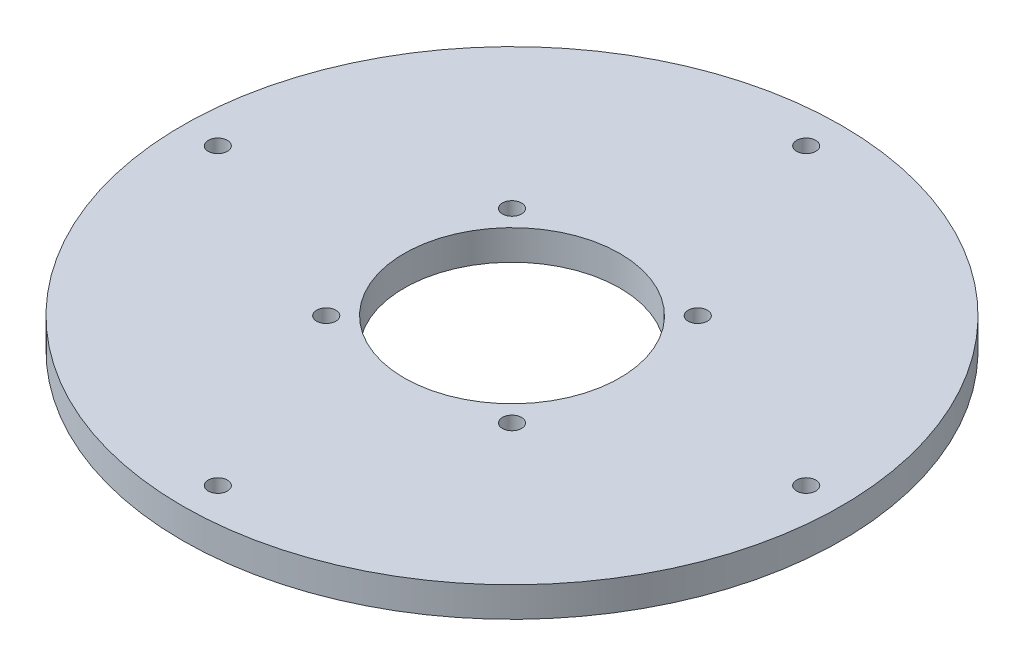
ISO-10303-21;
HEADER;
FILE_DESCRIPTION(('STEP AP214'),'2;1');
FILE_NAME('part.step','',(''),(''),'','','');
FILE_SCHEMA(('AUTOMOTIVE_DESIGN { 1 0 10303 214 1 1 1 1 }'));
ENDSEC;
DATA;
#1=APPLICATION_CONTEXT('core data for automotive mechanical design processes');
#2=APPLICATION_PROTOCOL_DEFINITION('international standard','automotive_design',2000,#1);
#3=PRODUCT_CONTEXT('',#1,'mechanical');
#4=PRODUCT('Part','Part','',(#3));
#5=PRODUCT_RELATED_PRODUCT_CATEGORY('part','',(#4));
#6=PRODUCT_DEFINITION_FORMATION('','',#4);
#7=PRODUCT_DEFINITION_CONTEXT('part definition',#1,'design');
#8=PRODUCT_DEFINITION('design','',#6,#7);
#9=PRODUCT_DEFINITION_SHAPE('','',#8);
#10=(LENGTH_UNIT() NAMED_UNIT(*) SI_UNIT(.MILLI.,.METRE.));
#11=(NAMED_UNIT(*) PLANE_ANGLE_UNIT() SI_UNIT($,.RADIAN.));
#12=(NAMED_UNIT(*) SI_UNIT($,.STERADIAN.) SOLID_ANGLE_UNIT());
#13=UNCERTAINTY_MEASURE_WITH_UNIT(LENGTH_MEASURE(1.E-05),#10,'distance_accuracy_value','');
#14=(GEOMETRIC_REPRESENTATION_CONTEXT(3) GLOBAL_UNCERTAINTY_ASSIGNED_CONTEXT((#13)) GLOBAL_UNIT_ASSIGNED_CONTEXT((#10,
#11,#12)) REPRESENTATION_CONTEXT('',''));
#15=CARTESIAN_POINT('',(0.,0.,0.));
#16=DIRECTION('',(0.,0.,1.));
#17=DIRECTION('',(1.,0.,0.));
#18=AXIS2_PLACEMENT_3D('',#15,#16,#17);
#19=CARTESIAN_POINT('',(0.,5.,0.));
#20=DIRECTION('',(0.,-1.,0.));
#21=DIRECTION('',(0.,0.,-1.));
#22=AXIS2_PLACEMENT_3D('',#19,#20,#21);
#23=PLANE('',#22);
#24=CARTESIAN_POINT('',(15.5,5.,15.5));
#25=DIRECTION('',(0.,1.,0.));
#26=DIRECTION('',(0.,0.,1.));
#27=AXIS2_PLACEMENT_3D('',#24,#25,#26);
#28=CIRCLE('',#27,1.6);
#29=CARTESIAN_POINT('',(15.5,5.,17.1));
#30=VERTEX_POINT('',#29);
#31=EDGE_CURVE('E66',#30,#30,#28,.T.);
#32=ORIENTED_EDGE('',*,*,#31,.F.);
#33=EDGE_LOOP('',(#32));
#34=FACE_BOUND('',#33,.T.);
#35=CARTESIAN_POINT('',(15.5,5.,-15.5));
#36=DIRECTION('',(0.,1.,0.));
#37=DIRECTION('',(0.,0.,1.));
#38=AXIS2_PLACEMENT_3D('',#35,#36,#37);
#39=CIRCLE('',#38,1.6);
#40=CARTESIAN_POINT('',(15.5,5.,-13.9));
#41=VERTEX_POINT('',#40);
#42=EDGE_CURVE('E73',#41,#41,#39,.T.);
#43=ORIENTED_EDGE('',*,*,#42,.F.);
#44=EDGE_LOOP('',(#43));
#45=FACE_BOUND('',#44,.T.);
#46=CARTESIAN_POINT('',(-15.5,5.,-15.5));
#47=DIRECTION('',(0.,1.,0.));
#48=DIRECTION('',(0.,0.,1.));
#49=AXIS2_PLACEMENT_3D('',#46,#47,#48);
#50=CIRCLE('',#49,1.6);
#51=CARTESIAN_POINT('',(-15.5,5.,-13.9));
#52=VERTEX_POINT('',#51);
#53=EDGE_CURVE('E60',#52,#52,#50,.T.);
#54=ORIENTED_EDGE('',*,*,#53,.F.);
#55=EDGE_LOOP('',(#54));
#56=FACE_BOUND('',#55,.T.);
#57=CARTESIAN_POINT('',(-15.5,5.,15.5));
#58=DIRECTION('',(0.,1.,0.));
#59=DIRECTION('',(0.,0.,1.));
#60=AXIS2_PLACEMENT_3D('',#57,#58,#59);
#61=CIRCLE('',#60,1.6);
#62=CARTESIAN_POINT('',(-15.5,5.,17.1));
#63=VERTEX_POINT('',#62);
#64=EDGE_CURVE('E57',#63,#63,#61,.T.);
#65=ORIENTED_EDGE('',*,*,#64,.F.);
#66=EDGE_LOOP('',(#65));
#67=FACE_BOUND('',#66,.T.);
#68=CARTESIAN_POINT('',(0.,5.,0.));
#69=DIRECTION('',(0.,1.,0.));
#70=DIRECTION('',(0.,0.,1.));
#71=AXIS2_PLACEMENT_3D('',#68,#69,#70);
#72=CIRCLE('',#71,18.);
#73=CARTESIAN_POINT('',(0.,5.,18.));
#74=VERTEX_POINT('',#73);
#75=EDGE_CURVE('E10',#74,#74,#72,.T.);
#76=ORIENTED_EDGE('',*,*,#75,.F.);
#77=EDGE_LOOP('',(#76));
#78=FACE_BOUND('',#77,.T.);
#79=CARTESIAN_POINT('',(-49.1,5.,0.));
#80=DIRECTION('',(0.,1.,0.));
#81=DIRECTION('',(0.,0.,1.));
#82=AXIS2_PLACEMENT_3D('',#79,#80,#81);
#83=CIRCLE('',#82,1.6);
#84=CARTESIAN_POINT('',(-49.1,5.,1.6));
#85=VERTEX_POINT('',#84);
#86=EDGE_CURVE('E94',#85,#85,#83,.T.);
#87=ORIENTED_EDGE('',*,*,#86,.F.);
#88=EDGE_LOOP('',(#87));
#89=FACE_BOUND('',#88,.T.);
#90=CARTESIAN_POINT('',(0.,5.,49.1));
#91=DIRECTION('',(0.,1.,0.));
#92=DIRECTION('',(0.,0.,1.));
#93=AXIS2_PLACEMENT_3D('',#90,#91,#92);
#94=CIRCLE('',#93,1.6);
#95=CARTESIAN_POINT('',(0.,5.,50.7));
#96=VERTEX_POINT('',#95);
#97=EDGE_CURVE('E91',#96,#96,#94,.T.);
#98=ORIENTED_EDGE('',*,*,#97,.F.);
#99=EDGE_LOOP('',(#98));
#100=FACE_BOUND('',#99,.T.);
#101=CARTESIAN_POINT('',(49.1,5.,0.));
#102=DIRECTION('',(0.,1.,0.));
#103=DIRECTION('',(0.,0.,1.));
#104=AXIS2_PLACEMENT_3D('',#101,#102,#103);
#105=CIRCLE('',#104,1.6);
#106=CARTESIAN_POINT('',(49.1,5.,1.6));
#107=VERTEX_POINT('',#106);
#108=EDGE_CURVE('E88',#107,#107,#105,.T.);
#109=ORIENTED_EDGE('',*,*,#108,.F.);
#110=EDGE_LOOP('',(#109));
#111=FACE_BOUND('',#110,.T.);
#112=CARTESIAN_POINT('',(0.,5.,-49.1));
#113=DIRECTION('',(0.,1.,0.));
#114=DIRECTION('',(0.,0.,1.));
#115=AXIS2_PLACEMENT_3D('',#112,#113,#114);
#116=CIRCLE('',#115,1.6);
#117=CARTESIAN_POINT('',(0.,5.,-47.5));
#118=VERTEX_POINT('',#117);
#119=EDGE_CURVE('E85',#118,#118,#116,.T.);
#120=ORIENTED_EDGE('',*,*,#119,.F.);
#121=EDGE_LOOP('',(#120));
#122=FACE_BOUND('',#121,.T.);
#123=CARTESIAN_POINT('',(0.,5.,0.));
#124=DIRECTION('',(0.,1.,0.));
#125=DIRECTION('',(0.,0.,1.));
#126=AXIS2_PLACEMENT_3D('',#123,#124,#125);
#127=CIRCLE('',#126,55.);
#128=CARTESIAN_POINT('',(0.,5.,55.));
#129=VERTEX_POINT('',#128);
#130=EDGE_CURVE('E81',#129,#129,#127,.T.);
#131=ORIENTED_EDGE('',*,*,#130,.T.);
#132=EDGE_LOOP('',(#131));
#133=FACE_BOUND('',#132,.T.);
#134=ADVANCED_FACE('F44',(#34,#45,#56,#67,#78,#89,#100,#111,#122,#133),#23,.F.);
#135=CARTESIAN_POINT('',(0.,0.,0.));
#136=DIRECTION('',(0.,-1.,0.));
#137=DIRECTION('',(0.,0.,-1.));
#138=AXIS2_PLACEMENT_3D('',#135,#136,#137);
#139=PLANE('',#138);
#140=CARTESIAN_POINT('',(15.5,0.,15.5));
#141=DIRECTION('',(0.,1.,0.));
#142=DIRECTION('',(0.,0.,1.));
#143=AXIS2_PLACEMENT_3D('',#140,#141,#142);
#144=CIRCLE('',#143,1.6);
#145=CARTESIAN_POINT('',(15.5,0.,17.1));
#146=VERTEX_POINT('',#145);
#147=EDGE_CURVE('E63',#146,#146,#144,.T.);
#148=ORIENTED_EDGE('',*,*,#147,.T.);
#149=EDGE_LOOP('',(#148));
#150=FACE_BOUND('',#149,.T.);
#151=CARTESIAN_POINT('',(15.5,0.,-15.5));
#152=DIRECTION('',(0.,1.,0.));
#153=DIRECTION('',(0.,0.,1.));
#154=AXIS2_PLACEMENT_3D('',#151,#152,#153);
#155=CIRCLE('',#154,1.6);
#156=CARTESIAN_POINT('',(15.5,0.,-13.9));
#157=VERTEX_POINT('',#156);
#158=EDGE_CURVE('E70',#157,#157,#155,.T.);
#159=ORIENTED_EDGE('',*,*,#158,.T.);
#160=EDGE_LOOP('',(#159));
#161=FACE_BOUND('',#160,.T.);
#162=CARTESIAN_POINT('',(-15.5,0.,-15.5));
#163=DIRECTION('',(0.,1.,0.));
#164=DIRECTION('',(0.,0.,1.));
#165=AXIS2_PLACEMENT_3D('',#162,#163,#164);
#166=CIRCLE('',#165,1.6);
#167=CARTESIAN_POINT('',(-15.5,0.,-13.9));
#168=VERTEX_POINT('',#167);
#169=EDGE_CURVE('E76',#168,#168,#166,.T.);
#170=ORIENTED_EDGE('',*,*,#169,.T.);
#171=EDGE_LOOP('',(#170));
#172=FACE_BOUND('',#171,.T.);
#173=CARTESIAN_POINT('',(-15.5,0.,15.5));
#174=DIRECTION('',(0.,1.,0.));
#175=DIRECTION('',(0.,0.,1.));
#176=AXIS2_PLACEMENT_3D('',#173,#174,#175);
#177=CIRCLE('',#176,1.6);
#178=CARTESIAN_POINT('',(-15.5,0.,17.1));
#179=VERTEX_POINT('',#178);
#180=EDGE_CURVE('E55',#179,#179,#177,.T.);
#181=ORIENTED_EDGE('',*,*,#180,.T.);
#182=EDGE_LOOP('',(#181));
#183=FACE_BOUND('',#182,.T.);
#184=CARTESIAN_POINT('',(0.,0.,0.));
#185=DIRECTION('',(0.,1.,0.));
#186=DIRECTION('',(0.,0.,1.));
#187=AXIS2_PLACEMENT_3D('',#184,#185,#186);
#188=CIRCLE('',#187,18.);
#189=CARTESIAN_POINT('',(0.,0.,18.));
#190=VERTEX_POINT('',#189);
#191=EDGE_CURVE('E48',#190,#190,#188,.T.);
#192=ORIENTED_EDGE('',*,*,#191,.T.);
#193=EDGE_LOOP('',(#192));
#194=FACE_BOUND('',#193,.T.);
#195=CARTESIAN_POINT('',(-49.1,0.,0.));
#196=DIRECTION('',(0.,1.,0.));
#197=DIRECTION('',(0.,0.,1.));
#198=AXIS2_PLACEMENT_3D('',#195,#196,#197);
#199=CIRCLE('',#198,1.6);
#200=CARTESIAN_POINT('',(-49.1,0.,1.6));
#201=VERTEX_POINT('',#200);
#202=EDGE_CURVE('E84',#201,#201,#199,.T.);
#203=ORIENTED_EDGE('',*,*,#202,.T.);
#204=EDGE_LOOP('',(#203));
#205=FACE_BOUND('',#204,.T.);
#206=CARTESIAN_POINT('',(0.,0.,49.1));
#207=DIRECTION('',(0.,1.,0.));
#208=DIRECTION('',(0.,0.,1.));
#209=AXIS2_PLACEMENT_3D('',#206,#207,#208);
#210=CIRCLE('',#209,1.6);
#211=CARTESIAN_POINT('',(0.,0.,50.7));
#212=VERTEX_POINT('',#211);
#213=EDGE_CURVE('E105',#212,#212,#210,.T.);
#214=ORIENTED_EDGE('',*,*,#213,.T.);
#215=EDGE_LOOP('',(#214));
#216=FACE_BOUND('',#215,.T.);
#217=CARTESIAN_POINT('',(49.1,0.,0.));
#218=DIRECTION('',(0.,1.,0.));
#219=DIRECTION('',(0.,0.,1.));
#220=AXIS2_PLACEMENT_3D('',#217,#218,#219);
#221=CIRCLE('',#220,1.6);
#222=CARTESIAN_POINT('',(49.1,0.,1.6));
#223=VERTEX_POINT('',#222);
#224=EDGE_CURVE('E102',#223,#223,#221,.T.);
#225=ORIENTED_EDGE('',*,*,#224,.T.);
#226=EDGE_LOOP('',(#225));
#227=FACE_BOUND('',#226,.T.);
#228=CARTESIAN_POINT('',(0.,0.,-49.1));
#229=DIRECTION('',(0.,1.,0.));
#230=DIRECTION('',(0.,0.,1.));
#231=AXIS2_PLACEMENT_3D('',#228,#229,#230);
#232=CIRCLE('',#231,1.6);
#233=CARTESIAN_POINT('',(0.,0.,-47.5));
#234=VERTEX_POINT('',#233);
#235=EDGE_CURVE('E99',#234,#234,#232,.T.);
#236=ORIENTED_EDGE('',*,*,#235,.T.);
#237=EDGE_LOOP('',(#236));
#238=FACE_BOUND('',#237,.T.);
#239=CARTESIAN_POINT('',(0.,0.,0.));
#240=DIRECTION('',(0.,1.,0.));
#241=DIRECTION('',(0.,0.,1.));
#242=AXIS2_PLACEMENT_3D('',#239,#240,#241);
#243=CIRCLE('',#242,55.);
#244=CARTESIAN_POINT('',(0.,0.,55.));
#245=VERTEX_POINT('',#244);
#246=EDGE_CURVE('E67',#245,#245,#243,.T.);
#247=ORIENTED_EDGE('',*,*,#246,.F.);
#248=EDGE_LOOP('',(#247));
#249=FACE_BOUND('',#248,.T.);
#250=ADVANCED_FACE('F46',(#150,#161,#172,#183,#194,#205,#216,#227,#238,#249),#139,.T.);
#251=CARTESIAN_POINT('',(0.,5.,0.));
#252=DIRECTION('',(0.,-1.,0.));
#253=DIRECTION('',(0.,0.,-1.));
#254=AXIS2_PLACEMENT_3D('',#251,#252,#253);
#255=CYLINDRICAL_SURFACE('',#254,18.);
#256=ORIENTED_EDGE('',*,*,#75,.T.);
#257=EDGE_LOOP('',(#256));
#258=FACE_BOUND('',#257,.T.);
#259=ORIENTED_EDGE('',*,*,#191,.F.);
#260=EDGE_LOOP('',(#259));
#261=FACE_BOUND('',#260,.T.);
#262=ADVANCED_FACE('F164',(#258,#261),#255,.F.);
#263=CARTESIAN_POINT('',(-15.5,0.,15.5));
#264=DIRECTION('',(0.,1.,0.));
#265=DIRECTION('',(0.,0.,1.));
#266=AXIS2_PLACEMENT_3D('',#263,#264,#265);
#267=CYLINDRICAL_SURFACE('',#266,1.6);
#268=ORIENTED_EDGE('',*,*,#180,.F.);
#269=EDGE_LOOP('',(#268));
#270=FACE_BOUND('',#269,.T.);
#271=ORIENTED_EDGE('',*,*,#64,.T.);
#272=EDGE_LOOP('',(#271));
#273=FACE_BOUND('',#272,.T.);
#274=ADVANCED_FACE('F154',(#270,#273),#267,.F.);
#275=CARTESIAN_POINT('',(-15.5,0.,-15.5));
#276=DIRECTION('',(0.,1.,0.));
#277=DIRECTION('',(0.,0.,1.));
#278=AXIS2_PLACEMENT_3D('',#275,#276,#277);
#279=CYLINDRICAL_SURFACE('',#278,1.6);
#280=ORIENTED_EDGE('',*,*,#169,.F.);
#281=EDGE_LOOP('',(#280));
#282=FACE_BOUND('',#281,.T.);
#283=ORIENTED_EDGE('',*,*,#53,.T.);
#284=EDGE_LOOP('',(#283));
#285=FACE_BOUND('',#284,.T.);
#286=ADVANCED_FACE('F150',(#282,#285),#279,.F.);
#287=CARTESIAN_POINT('',(15.5,0.,-15.5));
#288=DIRECTION('',(0.,1.,0.));
#289=DIRECTION('',(0.,0.,1.));
#290=AXIS2_PLACEMENT_3D('',#287,#288,#289);
#291=CYLINDRICAL_SURFACE('',#290,1.6);
#292=ORIENTED_EDGE('',*,*,#158,.F.);
#293=EDGE_LOOP('',(#292));
#294=FACE_BOUND('',#293,.T.);
#295=ORIENTED_EDGE('',*,*,#42,.T.);
#296=EDGE_LOOP('',(#295));
#297=FACE_BOUND('',#296,.T.);
#298=ADVANCED_FACE('F153',(#294,#297),#291,.F.);
#299=CARTESIAN_POINT('',(15.5,0.,15.5));
#300=DIRECTION('',(0.,1.,0.));
#301=DIRECTION('',(0.,0.,1.));
#302=AXIS2_PLACEMENT_3D('',#299,#300,#301);
#303=CYLINDRICAL_SURFACE('',#302,1.6);
#304=ORIENTED_EDGE('',*,*,#147,.F.);
#305=EDGE_LOOP('',(#304));
#306=FACE_BOUND('',#305,.T.);
#307=ORIENTED_EDGE('',*,*,#31,.T.);
#308=EDGE_LOOP('',(#307));
#309=FACE_BOUND('',#308,.T.);
#310=ADVANCED_FACE('F142',(#306,#309),#303,.F.);
#311=CARTESIAN_POINT('',(0.,0.,-49.1));
#312=DIRECTION('',(0.,1.,0.));
#313=DIRECTION('',(0.,0.,1.));
#314=AXIS2_PLACEMENT_3D('',#311,#312,#313);
#315=CYLINDRICAL_SURFACE('',#314,1.6);
#316=ORIENTED_EDGE('',*,*,#235,.F.);
#317=EDGE_LOOP('',(#316));
#318=FACE_BOUND('',#317,.T.);
#319=ORIENTED_EDGE('',*,*,#119,.T.);
#320=EDGE_LOOP('',(#319));
#321=FACE_BOUND('',#320,.T.);
#322=ADVANCED_FACE('F138',(#318,#321),#315,.F.);
#323=CARTESIAN_POINT('',(49.1,0.,0.));
#324=DIRECTION('',(0.,1.,0.));
#325=DIRECTION('',(0.,0.,1.));
#326=AXIS2_PLACEMENT_3D('',#323,#324,#325);
#327=CYLINDRICAL_SURFACE('',#326,1.6);
#328=ORIENTED_EDGE('',*,*,#224,.F.);
#329=EDGE_LOOP('',(#328));
#330=FACE_BOUND('',#329,.T.);
#331=ORIENTED_EDGE('',*,*,#108,.T.);
#332=EDGE_LOOP('',(#331));
#333=FACE_BOUND('',#332,.T.);
#334=ADVANCED_FACE('F141',(#330,#333),#327,.F.);
#335=CARTESIAN_POINT('',(0.,0.,49.1));
#336=DIRECTION('',(0.,1.,0.));
#337=DIRECTION('',(0.,0.,1.));
#338=AXIS2_PLACEMENT_3D('',#335,#336,#337);
#339=CYLINDRICAL_SURFACE('',#338,1.6);
#340=ORIENTED_EDGE('',*,*,#213,.F.);
#341=EDGE_LOOP('',(#340));
#342=FACE_BOUND('',#341,.T.);
#343=ORIENTED_EDGE('',*,*,#97,.T.);
#344=EDGE_LOOP('',(#343));
#345=FACE_BOUND('',#344,.T.);
#346=ADVANCED_FACE('F117',(#342,#345),#339,.F.);
#347=CARTESIAN_POINT('',(-49.1,0.,0.));
#348=DIRECTION('',(0.,1.,0.));
#349=DIRECTION('',(0.,0.,1.));
#350=AXIS2_PLACEMENT_3D('',#347,#348,#349);
#351=CYLINDRICAL_SURFACE('',#350,1.6);
#352=ORIENTED_EDGE('',*,*,#202,.F.);
#353=EDGE_LOOP('',(#352));
#354=FACE_BOUND('',#353,.T.);
#355=ORIENTED_EDGE('',*,*,#86,.T.);
#356=EDGE_LOOP('',(#355));
#357=FACE_BOUND('',#356,.T.);
#358=ADVANCED_FACE('F113',(#354,#357),#351,.F.);
#359=CARTESIAN_POINT('',(0.,0.,0.));
#360=DIRECTION('',(0.,1.,0.));
#361=DIRECTION('',(0.,0.,1.));
#362=AXIS2_PLACEMENT_3D('',#359,#360,#361);
#363=CYLINDRICAL_SURFACE('',#362,55.);
#364=ORIENTED_EDGE('',*,*,#246,.T.);
#365=EDGE_LOOP('',(#364));
#366=FACE_BOUND('',#365,.T.);
#367=ORIENTED_EDGE('',*,*,#130,.F.);
#368=EDGE_LOOP('',(#367));
#369=FACE_BOUND('',#368,.T.);
#370=ADVANCED_FACE('F116',(#366,#369),#363,.T.);
#371=CLOSED_SHELL('',(#134,#250,#262,#274,#286,#298,#310,#322,#334,#346,#358,#370));
#372=MANIFOLD_SOLID_BREP('B2',#371);
#373=ADVANCED_BREP_SHAPE_REPRESENTATION('',(#18,#372),#14);
#374=SHAPE_DEFINITION_REPRESENTATION(#9,#373);
ENDSEC;
END-ISO-10303-21;
